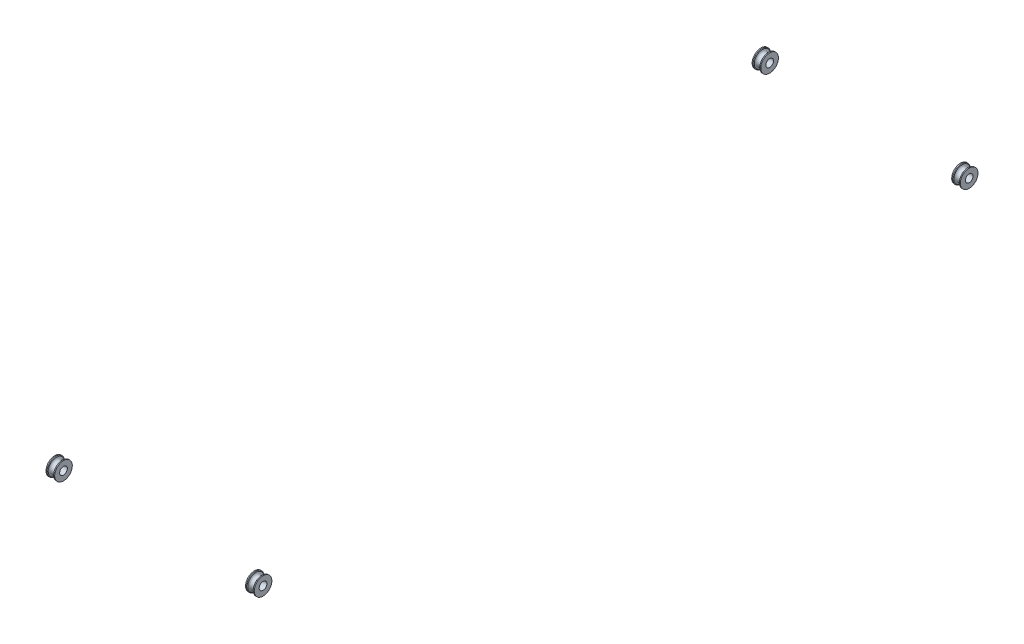
ISO-10303-21;
HEADER;
FILE_DESCRIPTION(('STEP AP214'),'2;1');
FILE_NAME('part.step','',(''),(''),'','','');
FILE_SCHEMA(('AUTOMOTIVE_DESIGN { 1 0 10303 214 1 1 1 1 }'));
ENDSEC;
DATA;
#1=APPLICATION_CONTEXT('core data for automotive mechanical design processes');
#2=APPLICATION_PROTOCOL_DEFINITION('international standard','automotive_design',2000,#1);
#3=PRODUCT_CONTEXT('',#1,'mechanical');
#4=PRODUCT('Part','Part','',(#3));
#5=PRODUCT_RELATED_PRODUCT_CATEGORY('part','',(#4));
#6=PRODUCT_DEFINITION_FORMATION('','',#4);
#7=PRODUCT_DEFINITION_CONTEXT('part definition',#1,'design');
#8=PRODUCT_DEFINITION('design','',#6,#7);
#9=PRODUCT_DEFINITION_SHAPE('','',#8);
#10=(LENGTH_UNIT() NAMED_UNIT(*) SI_UNIT(.MILLI.,.METRE.));
#11=(NAMED_UNIT(*) PLANE_ANGLE_UNIT() SI_UNIT($,.RADIAN.));
#12=(NAMED_UNIT(*) SI_UNIT($,.STERADIAN.) SOLID_ANGLE_UNIT());
#13=UNCERTAINTY_MEASURE_WITH_UNIT(LENGTH_MEASURE(1.E-05),#10,'distance_accuracy_value','');
#14=(GEOMETRIC_REPRESENTATION_CONTEXT(3) GLOBAL_UNCERTAINTY_ASSIGNED_CONTEXT((#13)) GLOBAL_UNIT_ASSIGNED_CONTEXT((#10,
#11,#12)) REPRESENTATION_CONTEXT('',''));
#15=CARTESIAN_POINT('',(0.,0.,0.));
#16=DIRECTION('',(0.,0.,1.));
#17=DIRECTION('',(1.,0.,0.));
#18=AXIS2_PLACEMENT_3D('',#15,#16,#17);
#19=CARTESIAN_POINT('',(102.4128,-70.8025,2.2225));
#20=DIRECTION('',(1.,0.,0.));
#21=DIRECTION('',(0.,0.,1.));
#22=AXIS2_PLACEMENT_3D('',#19,#20,#21);
#23=PLANE('',#22);
#24=CARTESIAN_POINT('',(102.4128,-70.8025,12.7000000000002));
#25=DIRECTION('',(1.,0.,0.));
#26=DIRECTION('',(0.,0.,-1.));
#27=AXIS2_PLACEMENT_3D('',#24,#25,#26);
#28=CIRCLE('',#27,6.35000000000008);
#29=CARTESIAN_POINT('',(102.4128,-70.8025,6.35000000000008));
#30=VERTEX_POINT('',#29);
#31=EDGE_CURVE('P0_E43',#30,#30,#28,.T.);
#32=ORIENTED_EDGE('',*,*,#31,.F.);
#33=EDGE_LOOP('',(#32));
#34=FACE_BOUND('',#33,.T.);
#35=CARTESIAN_POINT('',(102.4128,-70.8025,12.7000000000002));
#36=DIRECTION('',(1.,0.,0.));
#37=DIRECTION('',(0.,0.,-1.));
#38=AXIS2_PLACEMENT_3D('',#35,#36,#37);
#39=CIRCLE('',#38,14.605);
#40=CARTESIAN_POINT('',(102.4128,-70.8025,-1.90499999999984));
#41=VERTEX_POINT('',#40);
#42=EDGE_CURVE('P0_E10',#41,#41,#39,.T.);
#43=ORIENTED_EDGE('',*,*,#42,.T.);
#44=EDGE_LOOP('',(#43));
#45=FACE_BOUND('',#44,.T.);
#46=ADVANCED_FACE('P0_F15',(#34,#45),#23,.T.);
#47=CARTESIAN_POINT('',(95.25,-70.8025,12.7000000000002));
#48=DIRECTION('',(-1.,0.,0.));
#49=DIRECTION('',(0.,0.,-1.));
#50=AXIS2_PLACEMENT_3D('',#47,#48,#49);
#51=CYLINDRICAL_SURFACE('',#50,14.605);
#52=ORIENTED_EDGE('',*,*,#42,.F.);
#53=EDGE_LOOP('',(#52));
#54=FACE_BOUND('',#53,.T.);
#55=CARTESIAN_POINT('',(100.7364,-70.8025,12.7000000000002));
#56=DIRECTION('',(1.,0.,0.));
#57=DIRECTION('',(0.,0.,-1.));
#58=AXIS2_PLACEMENT_3D('',#55,#56,#57);
#59=CIRCLE('',#58,14.605);
#60=CARTESIAN_POINT('',(100.7364,-70.8025,-1.90499999999984));
#61=VERTEX_POINT('',#60);
#62=EDGE_CURVE('P0_E21',#61,#61,#59,.T.);
#63=ORIENTED_EDGE('',*,*,#62,.T.);
#64=EDGE_LOOP('',(#63));
#65=FACE_BOUND('',#64,.T.);
#66=ADVANCED_FACE('P0_F50',(#54,#65),#51,.T.);
#67=CARTESIAN_POINT('',(100.7364,-70.8025,12.7000000000002));
#68=DIRECTION('',(1.,0.,0.));
#69=DIRECTION('',(0.,0.,1.));
#70=AXIS2_PLACEMENT_3D('',#67,#68,#69);
#71=CONICAL_SURFACE('',#70,14.605,0.93804749179267);
#72=CARTESIAN_POINT('',(99.8982,-70.8025,12.7000000000002));
#73=DIRECTION('',(1.,0.,0.));
#74=DIRECTION('',(0.,0.,-1.));
#75=AXIS2_PLACEMENT_3D('',#72,#73,#74);
#76=CIRCLE('',#75,13.462);
#77=CARTESIAN_POINT('',(99.8982,-70.8025,-0.761999999999841));
#78=VERTEX_POINT('',#77);
#79=EDGE_CURVE('P0_E25',#78,#78,#76,.T.);
#80=ORIENTED_EDGE('',*,*,#79,.T.);
#81=EDGE_LOOP('',(#80));
#82=FACE_BOUND('',#81,.T.);
#83=ORIENTED_EDGE('',*,*,#62,.F.);
#84=EDGE_LOOP('',(#83));
#85=FACE_BOUND('',#84,.T.);
#86=ADVANCED_FACE('P0_F55',(#82,#85),#71,.T.);
#87=CARTESIAN_POINT('',(95.25,-70.8025,12.7000000000002));
#88=DIRECTION('',(-1.,0.,0.));
#89=DIRECTION('',(0.,0.,-1.));
#90=AXIS2_PLACEMENT_3D('',#87,#88,#89);
#91=TOROIDAL_SURFACE('',#90,14.605,4.78667026647959);
#92=ORIENTED_EDGE('',*,*,#79,.F.);
#93=EDGE_LOOP('',(#92));
#94=FACE_BOUND('',#93,.T.);
#95=CARTESIAN_POINT('',(90.6018,-70.8025,12.7000000000002));
#96=DIRECTION('',(1.,0.,0.));
#97=DIRECTION('',(0.,0.,-1.));
#98=AXIS2_PLACEMENT_3D('',#95,#96,#97);
#99=CIRCLE('',#98,13.462);
#100=CARTESIAN_POINT('',(90.6018,-70.8025,-0.761999999999841));
#101=VERTEX_POINT('',#100);
#102=EDGE_CURVE('P0_E29',#101,#101,#99,.T.);
#103=ORIENTED_EDGE('',*,*,#102,.T.);
#104=EDGE_LOOP('',(#103));
#105=FACE_BOUND('',#104,.T.);
#106=ADVANCED_FACE('P0_F60',(#94,#105),#91,.F.);
#107=CARTESIAN_POINT('',(89.7636,-70.8025,12.7000000000002));
#108=DIRECTION('',(-1.,0.,0.));
#109=DIRECTION('',(0.,0.,-1.));
#110=AXIS2_PLACEMENT_3D('',#107,#108,#109);
#111=CONICAL_SURFACE('',#110,14.605,0.938047491792655);
#112=ORIENTED_EDGE('',*,*,#102,.F.);
#113=EDGE_LOOP('',(#112));
#114=FACE_BOUND('',#113,.T.);
#115=CARTESIAN_POINT('',(89.7636,-70.8025,12.7000000000002));
#116=DIRECTION('',(1.,0.,0.));
#117=DIRECTION('',(0.,0.,-1.));
#118=AXIS2_PLACEMENT_3D('',#115,#116,#117);
#119=CIRCLE('',#118,14.605);
#120=CARTESIAN_POINT('',(89.7636,-70.8025,-1.90499999999984));
#121=VERTEX_POINT('',#120);
#122=EDGE_CURVE('P0_E34',#121,#121,#119,.T.);
#123=ORIENTED_EDGE('',*,*,#122,.T.);
#124=EDGE_LOOP('',(#123));
#125=FACE_BOUND('',#124,.T.);
#126=ADVANCED_FACE('P0_F66',(#114,#125),#111,.T.);
#127=CARTESIAN_POINT('',(95.25,-70.8025,12.7000000000002));
#128=DIRECTION('',(-1.,0.,0.));
#129=DIRECTION('',(0.,0.,-1.));
#130=AXIS2_PLACEMENT_3D('',#127,#128,#129);
#131=CYLINDRICAL_SURFACE('',#130,14.605);
#132=ORIENTED_EDGE('',*,*,#122,.F.);
#133=EDGE_LOOP('',(#132));
#134=FACE_BOUND('',#133,.T.);
#135=CARTESIAN_POINT('',(88.0872,-70.8025,12.7000000000002));
#136=DIRECTION('',(1.,0.,0.));
#137=DIRECTION('',(0.,0.,-1.));
#138=AXIS2_PLACEMENT_3D('',#135,#136,#137);
#139=CIRCLE('',#138,14.605);
#140=CARTESIAN_POINT('',(88.0872,-70.8025,-1.90499999999984));
#141=VERTEX_POINT('',#140);
#142=EDGE_CURVE('P0_E37',#141,#141,#139,.T.);
#143=ORIENTED_EDGE('',*,*,#142,.T.);
#144=EDGE_LOOP('',(#143));
#145=FACE_BOUND('',#144,.T.);
#146=ADVANCED_FACE('P0_F70',(#134,#145),#131,.T.);
#147=CARTESIAN_POINT('',(88.0872,-70.8025,2.2225));
#148=DIRECTION('',(-1.,0.,0.));
#149=DIRECTION('',(0.,0.,-1.));
#150=AXIS2_PLACEMENT_3D('',#147,#148,#149);
#151=PLANE('',#150);
#152=ORIENTED_EDGE('',*,*,#142,.F.);
#153=EDGE_LOOP('',(#152));
#154=FACE_BOUND('',#153,.T.);
#155=CARTESIAN_POINT('',(88.0872,-70.8025,12.7000000000002));
#156=DIRECTION('',(1.,0.,0.));
#157=DIRECTION('',(0.,0.,-1.));
#158=AXIS2_PLACEMENT_3D('',#155,#156,#157);
#159=CIRCLE('',#158,6.35000000000008);
#160=CARTESIAN_POINT('',(88.0872,-70.8025,6.35000000000008));
#161=VERTEX_POINT('',#160);
#162=EDGE_CURVE('P0_E40',#161,#161,#159,.T.);
#163=ORIENTED_EDGE('',*,*,#162,.T.);
#164=EDGE_LOOP('',(#163));
#165=FACE_BOUND('',#164,.T.);
#166=ADVANCED_FACE('P0_F74',(#154,#165),#151,.T.);
#167=CARTESIAN_POINT('',(95.25,-70.8025,12.7000000000002));
#168=DIRECTION('',(-1.,0.,0.));
#169=DIRECTION('',(0.,0.,-1.));
#170=AXIS2_PLACEMENT_3D('',#167,#168,#169);
#171=CYLINDRICAL_SURFACE('',#170,6.35000000000008);
#172=ORIENTED_EDGE('',*,*,#162,.F.);
#173=EDGE_LOOP('',(#172));
#174=FACE_BOUND('',#173,.T.);
#175=ORIENTED_EDGE('',*,*,#31,.T.);
#176=EDGE_LOOP('',(#175));
#177=FACE_BOUND('',#176,.T.);
#178=ADVANCED_FACE('P0_F47',(#174,#177),#171,.F.);
#179=CLOSED_SHELL('',(#46,#66,#86,#106,#126,#146,#166,#178));
#180=MANIFOLD_SOLID_BREP('P0_B1',#179);
#181=CARTESIAN_POINT('',(102.4128,-70.8025,1191.5775));
#182=DIRECTION('',(1.,0.,0.));
#183=DIRECTION('',(0.,0.,-1.));
#184=AXIS2_PLACEMENT_3D('',#181,#182,#183);
#185=PLANE('',#184);
#186=CARTESIAN_POINT('',(102.4128,-70.8025,1181.1));
#187=DIRECTION('',(-1.,0.,0.));
#188=DIRECTION('',(0.,0.,1.));
#189=AXIS2_PLACEMENT_3D('',#186,#187,#188);
#190=CIRCLE('',#189,6.35000000000008);
#191=CARTESIAN_POINT('',(102.4128,-70.8025,1187.45));
#192=VERTEX_POINT('',#191);
#193=EDGE_CURVE('P1_E43',#192,#192,#190,.T.);
#194=ORIENTED_EDGE('',*,*,#193,.T.);
#195=EDGE_LOOP('',(#194));
#196=FACE_BOUND('',#195,.T.);
#197=CARTESIAN_POINT('',(102.4128,-70.8025,1181.1));
#198=DIRECTION('',(-1.,0.,0.));
#199=DIRECTION('',(0.,0.,1.));
#200=AXIS2_PLACEMENT_3D('',#197,#198,#199);
#201=CIRCLE('',#200,14.605);
#202=CARTESIAN_POINT('',(102.4128,-70.8025,1195.705));
#203=VERTEX_POINT('',#202);
#204=EDGE_CURVE('P1_E10',#203,#203,#201,.T.);
#205=ORIENTED_EDGE('',*,*,#204,.F.);
#206=EDGE_LOOP('',(#205));
#207=FACE_BOUND('',#206,.T.);
#208=ADVANCED_FACE('P1_F15',(#196,#207),#185,.T.);
#209=CARTESIAN_POINT('',(95.25,-70.8025,1181.1));
#210=DIRECTION('',(-1.,0.,0.));
#211=DIRECTION('',(0.,0.,1.));
#212=AXIS2_PLACEMENT_3D('',#209,#210,#211);
#213=CYLINDRICAL_SURFACE('',#212,14.605);
#214=ORIENTED_EDGE('',*,*,#204,.T.);
#215=EDGE_LOOP('',(#214));
#216=FACE_BOUND('',#215,.T.);
#217=CARTESIAN_POINT('',(100.7364,-70.8025,1181.1));
#218=DIRECTION('',(-1.,0.,0.));
#219=DIRECTION('',(0.,0.,1.));
#220=AXIS2_PLACEMENT_3D('',#217,#218,#219);
#221=CIRCLE('',#220,14.605);
#222=CARTESIAN_POINT('',(100.7364,-70.8025,1195.705));
#223=VERTEX_POINT('',#222);
#224=EDGE_CURVE('P1_E21',#223,#223,#221,.T.);
#225=ORIENTED_EDGE('',*,*,#224,.F.);
#226=EDGE_LOOP('',(#225));
#227=FACE_BOUND('',#226,.T.);
#228=ADVANCED_FACE('P1_F62',(#216,#227),#213,.T.);
#229=CARTESIAN_POINT('',(100.7364,-70.8025,1181.1));
#230=DIRECTION('',(1.,0.,0.));
#231=DIRECTION('',(0.,0.,-1.));
#232=AXIS2_PLACEMENT_3D('',#229,#230,#231);
#233=CONICAL_SURFACE('',#232,14.605,0.93804749179267);
#234=CARTESIAN_POINT('',(99.8982,-70.8025,1181.1));
#235=DIRECTION('',(-1.,0.,0.));
#236=DIRECTION('',(0.,0.,1.));
#237=AXIS2_PLACEMENT_3D('',#234,#235,#236);
#238=CIRCLE('',#237,13.462);
#239=CARTESIAN_POINT('',(99.8982,-70.8025,1194.562));
#240=VERTEX_POINT('',#239);
#241=EDGE_CURVE('P1_E25',#240,#240,#238,.T.);
#242=ORIENTED_EDGE('',*,*,#241,.F.);
#243=EDGE_LOOP('',(#242));
#244=FACE_BOUND('',#243,.T.);
#245=ORIENTED_EDGE('',*,*,#224,.T.);
#246=EDGE_LOOP('',(#245));
#247=FACE_BOUND('',#246,.T.);
#248=ADVANCED_FACE('P1_F66',(#244,#247),#233,.T.);
#249=CARTESIAN_POINT('',(95.25,-70.8025,1181.1));
#250=DIRECTION('',(-1.,0.,0.));
#251=DIRECTION('',(0.,0.,1.));
#252=AXIS2_PLACEMENT_3D('',#249,#250,#251);
#253=TOROIDAL_SURFACE('',#252,14.605,4.78667026647959);
#254=ORIENTED_EDGE('',*,*,#241,.T.);
#255=EDGE_LOOP('',(#254));
#256=FACE_BOUND('',#255,.T.);
#257=CARTESIAN_POINT('',(90.6018,-70.8025,1181.1));
#258=DIRECTION('',(-1.,0.,0.));
#259=DIRECTION('',(0.,0.,1.));
#260=AXIS2_PLACEMENT_3D('',#257,#258,#259);
#261=CIRCLE('',#260,13.462);
#262=CARTESIAN_POINT('',(90.6018,-70.8025,1194.562));
#263=VERTEX_POINT('',#262);
#264=EDGE_CURVE('P1_E29',#263,#263,#261,.T.);
#265=ORIENTED_EDGE('',*,*,#264,.F.);
#266=EDGE_LOOP('',(#265));
#267=FACE_BOUND('',#266,.T.);
#268=ADVANCED_FACE('P1_F70',(#256,#267),#253,.F.);
#269=CARTESIAN_POINT('',(89.7636,-70.8025,1181.1));
#270=DIRECTION('',(-1.,0.,0.));
#271=DIRECTION('',(0.,0.,1.));
#272=AXIS2_PLACEMENT_3D('',#269,#270,#271);
#273=CONICAL_SURFACE('',#272,14.605,0.938047491792655);
#274=ORIENTED_EDGE('',*,*,#264,.T.);
#275=EDGE_LOOP('',(#274));
#276=FACE_BOUND('',#275,.T.);
#277=CARTESIAN_POINT('',(89.7636,-70.8025,1181.1));
#278=DIRECTION('',(-1.,0.,0.));
#279=DIRECTION('',(0.,0.,1.));
#280=AXIS2_PLACEMENT_3D('',#277,#278,#279);
#281=CIRCLE('',#280,14.605);
#282=CARTESIAN_POINT('',(89.7636,-70.8025,1195.705));
#283=VERTEX_POINT('',#282);
#284=EDGE_CURVE('P1_E34',#283,#283,#281,.T.);
#285=ORIENTED_EDGE('',*,*,#284,.F.);
#286=EDGE_LOOP('',(#285));
#287=FACE_BOUND('',#286,.T.);
#288=ADVANCED_FACE('P1_F77',(#276,#287),#273,.T.);
#289=CARTESIAN_POINT('',(95.25,-70.8025,1181.1));
#290=DIRECTION('',(-1.,0.,0.));
#291=DIRECTION('',(0.,0.,1.));
#292=AXIS2_PLACEMENT_3D('',#289,#290,#291);
#293=CYLINDRICAL_SURFACE('',#292,14.605);
#294=ORIENTED_EDGE('',*,*,#284,.T.);
#295=EDGE_LOOP('',(#294));
#296=FACE_BOUND('',#295,.T.);
#297=CARTESIAN_POINT('',(88.0872,-70.8025,1181.1));
#298=DIRECTION('',(-1.,0.,0.));
#299=DIRECTION('',(0.,0.,1.));
#300=AXIS2_PLACEMENT_3D('',#297,#298,#299);
#301=CIRCLE('',#300,14.605);
#302=CARTESIAN_POINT('',(88.0872,-70.8025,1195.705));
#303=VERTEX_POINT('',#302);
#304=EDGE_CURVE('P1_E37',#303,#303,#301,.T.);
#305=ORIENTED_EDGE('',*,*,#304,.F.);
#306=EDGE_LOOP('',(#305));
#307=FACE_BOUND('',#306,.T.);
#308=ADVANCED_FACE('P1_F58',(#296,#307),#293,.T.);
#309=CARTESIAN_POINT('',(88.0872,-70.8025,1191.5775));
#310=DIRECTION('',(-1.,0.,0.));
#311=DIRECTION('',(0.,0.,1.));
#312=AXIS2_PLACEMENT_3D('',#309,#310,#311);
#313=PLANE('',#312);
#314=ORIENTED_EDGE('',*,*,#304,.T.);
#315=EDGE_LOOP('',(#314));
#316=FACE_BOUND('',#315,.T.);
#317=CARTESIAN_POINT('',(88.0872,-70.8025,1181.1));
#318=DIRECTION('',(-1.,0.,0.));
#319=DIRECTION('',(0.,0.,1.));
#320=AXIS2_PLACEMENT_3D('',#317,#318,#319);
#321=CIRCLE('',#320,6.35000000000008);
#322=CARTESIAN_POINT('',(88.0872,-70.8025,1187.45));
#323=VERTEX_POINT('',#322);
#324=EDGE_CURVE('P1_E40',#323,#323,#321,.T.);
#325=ORIENTED_EDGE('',*,*,#324,.F.);
#326=EDGE_LOOP('',(#325));
#327=FACE_BOUND('',#326,.T.);
#328=ADVANCED_FACE('P1_F51',(#316,#327),#313,.T.);
#329=CARTESIAN_POINT('',(95.25,-70.8025,1181.1));
#330=DIRECTION('',(-1.,0.,0.));
#331=DIRECTION('',(0.,0.,1.));
#332=AXIS2_PLACEMENT_3D('',#329,#330,#331);
#333=CYLINDRICAL_SURFACE('',#332,6.35000000000008);
#334=ORIENTED_EDGE('',*,*,#324,.T.);
#335=EDGE_LOOP('',(#334));
#336=FACE_BOUND('',#335,.T.);
#337=ORIENTED_EDGE('',*,*,#193,.F.);
#338=EDGE_LOOP('',(#337));
#339=FACE_BOUND('',#338,.T.);
#340=ADVANCED_FACE('P1_F49',(#336,#339),#333,.F.);
#341=CLOSED_SHELL('',(#208,#228,#248,#268,#288,#308,#328,#340));
#342=MANIFOLD_SOLID_BREP('P1_B1',#341);
#343=CARTESIAN_POINT('',(418.2872,-70.8025,1191.5775));
#344=DIRECTION('',(-1.,0.,0.));
#345=DIRECTION('',(0.,0.,-1.));
#346=AXIS2_PLACEMENT_3D('',#343,#344,#345);
#347=PLANE('',#346);
#348=CARTESIAN_POINT('',(418.2872,-70.8025,1181.1));
#349=DIRECTION('',(-1.,0.,0.));
#350=DIRECTION('',(0.,0.,1.));
#351=AXIS2_PLACEMENT_3D('',#348,#349,#350);
#352=CIRCLE('',#351,6.35000000000008);
#353=CARTESIAN_POINT('',(418.2872,-70.8025,1187.45));
#354=VERTEX_POINT('',#353);
#355=EDGE_CURVE('P2_E43',#354,#354,#352,.T.);
#356=ORIENTED_EDGE('',*,*,#355,.F.);
#357=EDGE_LOOP('',(#356));
#358=FACE_BOUND('',#357,.T.);
#359=CARTESIAN_POINT('',(418.2872,-70.8025,1181.1));
#360=DIRECTION('',(-1.,0.,0.));
#361=DIRECTION('',(0.,0.,1.));
#362=AXIS2_PLACEMENT_3D('',#359,#360,#361);
#363=CIRCLE('',#362,14.605);
#364=CARTESIAN_POINT('',(418.2872,-70.8025,1195.705));
#365=VERTEX_POINT('',#364);
#366=EDGE_CURVE('P2_E10',#365,#365,#363,.T.);
#367=ORIENTED_EDGE('',*,*,#366,.T.);
#368=EDGE_LOOP('',(#367));
#369=FACE_BOUND('',#368,.T.);
#370=ADVANCED_FACE('P2_F15',(#358,#369),#347,.T.);
#371=CARTESIAN_POINT('',(425.45,-70.8025,1181.1));
#372=DIRECTION('',(1.,0.,0.));
#373=DIRECTION('',(0.,0.,1.));
#374=AXIS2_PLACEMENT_3D('',#371,#372,#373);
#375=CYLINDRICAL_SURFACE('',#374,14.605);
#376=ORIENTED_EDGE('',*,*,#366,.F.);
#377=EDGE_LOOP('',(#376));
#378=FACE_BOUND('',#377,.T.);
#379=CARTESIAN_POINT('',(419.9636,-70.8025,1181.1));
#380=DIRECTION('',(-1.,0.,0.));
#381=DIRECTION('',(0.,0.,1.));
#382=AXIS2_PLACEMENT_3D('',#379,#380,#381);
#383=CIRCLE('',#382,14.605);
#384=CARTESIAN_POINT('',(419.9636,-70.8025,1195.705));
#385=VERTEX_POINT('',#384);
#386=EDGE_CURVE('P2_E21',#385,#385,#383,.T.);
#387=ORIENTED_EDGE('',*,*,#386,.T.);
#388=EDGE_LOOP('',(#387));
#389=FACE_BOUND('',#388,.T.);
#390=ADVANCED_FACE('P2_F50',(#378,#389),#375,.T.);
#391=CARTESIAN_POINT('',(419.9636,-70.8025,1181.1));
#392=DIRECTION('',(-1.,0.,0.));
#393=DIRECTION('',(0.,0.,-1.));
#394=AXIS2_PLACEMENT_3D('',#391,#392,#393);
#395=CONICAL_SURFACE('',#394,14.605,0.93804749179267);
#396=CARTESIAN_POINT('',(420.8018,-70.8025,1181.1));
#397=DIRECTION('',(-1.,0.,0.));
#398=DIRECTION('',(0.,0.,1.));
#399=AXIS2_PLACEMENT_3D('',#396,#397,#398);
#400=CIRCLE('',#399,13.462);
#401=CARTESIAN_POINT('',(420.8018,-70.8025,1194.562));
#402=VERTEX_POINT('',#401);
#403=EDGE_CURVE('P2_E25',#402,#402,#400,.T.);
#404=ORIENTED_EDGE('',*,*,#403,.T.);
#405=EDGE_LOOP('',(#404));
#406=FACE_BOUND('',#405,.T.);
#407=ORIENTED_EDGE('',*,*,#386,.F.);
#408=EDGE_LOOP('',(#407));
#409=FACE_BOUND('',#408,.T.);
#410=ADVANCED_FACE('P2_F55',(#406,#409),#395,.T.);
#411=CARTESIAN_POINT('',(425.45,-70.8025,1181.1));
#412=DIRECTION('',(1.,0.,0.));
#413=DIRECTION('',(0.,0.,1.));
#414=AXIS2_PLACEMENT_3D('',#411,#412,#413);
#415=TOROIDAL_SURFACE('',#414,14.605,4.78667026647959);
#416=ORIENTED_EDGE('',*,*,#403,.F.);
#417=EDGE_LOOP('',(#416));
#418=FACE_BOUND('',#417,.T.);
#419=CARTESIAN_POINT('',(430.0982,-70.8025,1181.1));
#420=DIRECTION('',(-1.,0.,0.));
#421=DIRECTION('',(0.,0.,1.));
#422=AXIS2_PLACEMENT_3D('',#419,#420,#421);
#423=CIRCLE('',#422,13.462);
#424=CARTESIAN_POINT('',(430.0982,-70.8025,1194.562));
#425=VERTEX_POINT('',#424);
#426=EDGE_CURVE('P2_E29',#425,#425,#423,.T.);
#427=ORIENTED_EDGE('',*,*,#426,.T.);
#428=EDGE_LOOP('',(#427));
#429=FACE_BOUND('',#428,.T.);
#430=ADVANCED_FACE('P2_F60',(#418,#429),#415,.F.);
#431=CARTESIAN_POINT('',(430.9364,-70.8025,1181.1));
#432=DIRECTION('',(1.,0.,0.));
#433=DIRECTION('',(0.,0.,1.));
#434=AXIS2_PLACEMENT_3D('',#431,#432,#433);
#435=CONICAL_SURFACE('',#434,14.605,0.938047491792655);
#436=ORIENTED_EDGE('',*,*,#426,.F.);
#437=EDGE_LOOP('',(#436));
#438=FACE_BOUND('',#437,.T.);
#439=CARTESIAN_POINT('',(430.9364,-70.8025,1181.1));
#440=DIRECTION('',(-1.,0.,0.));
#441=DIRECTION('',(0.,0.,1.));
#442=AXIS2_PLACEMENT_3D('',#439,#440,#441);
#443=CIRCLE('',#442,14.605);
#444=CARTESIAN_POINT('',(430.9364,-70.8025,1195.705));
#445=VERTEX_POINT('',#444);
#446=EDGE_CURVE('P2_E34',#445,#445,#443,.T.);
#447=ORIENTED_EDGE('',*,*,#446,.T.);
#448=EDGE_LOOP('',(#447));
#449=FACE_BOUND('',#448,.T.);
#450=ADVANCED_FACE('P2_F66',(#438,#449),#435,.T.);
#451=CARTESIAN_POINT('',(425.45,-70.8025,1181.1));
#452=DIRECTION('',(1.,0.,0.));
#453=DIRECTION('',(0.,0.,1.));
#454=AXIS2_PLACEMENT_3D('',#451,#452,#453);
#455=CYLINDRICAL_SURFACE('',#454,14.605);
#456=ORIENTED_EDGE('',*,*,#446,.F.);
#457=EDGE_LOOP('',(#456));
#458=FACE_BOUND('',#457,.T.);
#459=CARTESIAN_POINT('',(432.6128,-70.8025,1181.1));
#460=DIRECTION('',(-1.,0.,0.));
#461=DIRECTION('',(0.,0.,1.));
#462=AXIS2_PLACEMENT_3D('',#459,#460,#461);
#463=CIRCLE('',#462,14.605);
#464=CARTESIAN_POINT('',(432.6128,-70.8025,1195.705));
#465=VERTEX_POINT('',#464);
#466=EDGE_CURVE('P2_E37',#465,#465,#463,.T.);
#467=ORIENTED_EDGE('',*,*,#466,.T.);
#468=EDGE_LOOP('',(#467));
#469=FACE_BOUND('',#468,.T.);
#470=ADVANCED_FACE('P2_F70',(#458,#469),#455,.T.);
#471=CARTESIAN_POINT('',(432.6128,-70.8025,1191.5775));
#472=DIRECTION('',(1.,0.,0.));
#473=DIRECTION('',(0.,0.,1.));
#474=AXIS2_PLACEMENT_3D('',#471,#472,#473);
#475=PLANE('',#474);
#476=ORIENTED_EDGE('',*,*,#466,.F.);
#477=EDGE_LOOP('',(#476));
#478=FACE_BOUND('',#477,.T.);
#479=CARTESIAN_POINT('',(432.6128,-70.8025,1181.1));
#480=DIRECTION('',(-1.,0.,0.));
#481=DIRECTION('',(0.,0.,1.));
#482=AXIS2_PLACEMENT_3D('',#479,#480,#481);
#483=CIRCLE('',#482,6.35000000000008);
#484=CARTESIAN_POINT('',(432.6128,-70.8025,1187.45));
#485=VERTEX_POINT('',#484);
#486=EDGE_CURVE('P2_E40',#485,#485,#483,.T.);
#487=ORIENTED_EDGE('',*,*,#486,.T.);
#488=EDGE_LOOP('',(#487));
#489=FACE_BOUND('',#488,.T.);
#490=ADVANCED_FACE('P2_F74',(#478,#489),#475,.T.);
#491=CARTESIAN_POINT('',(425.45,-70.8025,1181.1));
#492=DIRECTION('',(1.,0.,0.));
#493=DIRECTION('',(0.,0.,1.));
#494=AXIS2_PLACEMENT_3D('',#491,#492,#493);
#495=CYLINDRICAL_SURFACE('',#494,6.35000000000008);
#496=ORIENTED_EDGE('',*,*,#486,.F.);
#497=EDGE_LOOP('',(#496));
#498=FACE_BOUND('',#497,.T.);
#499=ORIENTED_EDGE('',*,*,#355,.T.);
#500=EDGE_LOOP('',(#499));
#501=FACE_BOUND('',#500,.T.);
#502=ADVANCED_FACE('P2_F47',(#498,#501),#495,.F.);
#503=CLOSED_SHELL('',(#370,#390,#410,#430,#450,#470,#490,#502));
#504=MANIFOLD_SOLID_BREP('P2_B1',#503);
#505=CARTESIAN_POINT('',(418.2872,-70.8025,2.2225));
#506=DIRECTION('',(-1.,0.,0.));
#507=DIRECTION('',(0.,0.,1.));
#508=AXIS2_PLACEMENT_3D('',#505,#506,#507);
#509=PLANE('',#508);
#510=CARTESIAN_POINT('',(418.2872,-70.8025,12.7));
#511=DIRECTION('',(1.,0.,0.));
#512=DIRECTION('',(0.,0.,-1.));
#513=AXIS2_PLACEMENT_3D('',#510,#511,#512);
#514=CIRCLE('',#513,6.35000000000008);
#515=CARTESIAN_POINT('',(418.2872,-70.8025,6.34999999999992));
#516=VERTEX_POINT('',#515);
#517=EDGE_CURVE('P3_E43',#516,#516,#514,.T.);
#518=ORIENTED_EDGE('',*,*,#517,.T.);
#519=EDGE_LOOP('',(#518));
#520=FACE_BOUND('',#519,.T.);
#521=CARTESIAN_POINT('',(418.2872,-70.8025,12.7));
#522=DIRECTION('',(1.,0.,0.));
#523=DIRECTION('',(0.,0.,-1.));
#524=AXIS2_PLACEMENT_3D('',#521,#522,#523);
#525=CIRCLE('',#524,14.605);
#526=CARTESIAN_POINT('',(418.2872,-70.8025,-1.905));
#527=VERTEX_POINT('',#526);
#528=EDGE_CURVE('P3_E10',#527,#527,#525,.T.);
#529=ORIENTED_EDGE('',*,*,#528,.F.);
#530=EDGE_LOOP('',(#529));
#531=FACE_BOUND('',#530,.T.);
#532=ADVANCED_FACE('P3_F15',(#520,#531),#509,.T.);
#533=CARTESIAN_POINT('',(425.45,-70.8025,12.7));
#534=DIRECTION('',(1.,0.,0.));
#535=DIRECTION('',(0.,0.,-1.));
#536=AXIS2_PLACEMENT_3D('',#533,#534,#535);
#537=CYLINDRICAL_SURFACE('',#536,14.605);
#538=ORIENTED_EDGE('',*,*,#528,.T.);
#539=EDGE_LOOP('',(#538));
#540=FACE_BOUND('',#539,.T.);
#541=CARTESIAN_POINT('',(419.9636,-70.8025,12.7));
#542=DIRECTION('',(1.,0.,0.));
#543=DIRECTION('',(0.,0.,-1.));
#544=AXIS2_PLACEMENT_3D('',#541,#542,#543);
#545=CIRCLE('',#544,14.605);
#546=CARTESIAN_POINT('',(419.9636,-70.8025,-1.905));
#547=VERTEX_POINT('',#546);
#548=EDGE_CURVE('P3_E21',#547,#547,#545,.T.);
#549=ORIENTED_EDGE('',*,*,#548,.F.);
#550=EDGE_LOOP('',(#549));
#551=FACE_BOUND('',#550,.T.);
#552=ADVANCED_FACE('P3_F62',(#540,#551),#537,.T.);
#553=CARTESIAN_POINT('',(419.9636,-70.8025,12.7));
#554=DIRECTION('',(-1.,0.,0.));
#555=DIRECTION('',(0.,0.,1.));
#556=AXIS2_PLACEMENT_3D('',#553,#554,#555);
#557=CONICAL_SURFACE('',#556,14.605,0.93804749179267);
#558=CARTESIAN_POINT('',(420.8018,-70.8025,12.7));
#559=DIRECTION('',(1.,0.,0.));
#560=DIRECTION('',(0.,0.,-1.));
#561=AXIS2_PLACEMENT_3D('',#558,#559,#560);
#562=CIRCLE('',#561,13.462);
#563=CARTESIAN_POINT('',(420.8018,-70.8025,-0.762000000000001));
#564=VERTEX_POINT('',#563);
#565=EDGE_CURVE('P3_E25',#564,#564,#562,.T.);
#566=ORIENTED_EDGE('',*,*,#565,.F.);
#567=EDGE_LOOP('',(#566));
#568=FACE_BOUND('',#567,.T.);
#569=ORIENTED_EDGE('',*,*,#548,.T.);
#570=EDGE_LOOP('',(#569));
#571=FACE_BOUND('',#570,.T.);
#572=ADVANCED_FACE('P3_F66',(#568,#571),#557,.T.);
#573=CARTESIAN_POINT('',(425.45,-70.8025,12.7));
#574=DIRECTION('',(1.,0.,0.));
#575=DIRECTION('',(0.,0.,-1.));
#576=AXIS2_PLACEMENT_3D('',#573,#574,#575);
#577=TOROIDAL_SURFACE('',#576,14.605,4.78667026647959);
#578=ORIENTED_EDGE('',*,*,#565,.T.);
#579=EDGE_LOOP('',(#578));
#580=FACE_BOUND('',#579,.T.);
#581=CARTESIAN_POINT('',(430.0982,-70.8025,12.7));
#582=DIRECTION('',(1.,0.,0.));
#583=DIRECTION('',(0.,0.,-1.));
#584=AXIS2_PLACEMENT_3D('',#581,#582,#583);
#585=CIRCLE('',#584,13.462);
#586=CARTESIAN_POINT('',(430.0982,-70.8025,-0.762000000000001));
#587=VERTEX_POINT('',#586);
#588=EDGE_CURVE('P3_E29',#587,#587,#585,.T.);
#589=ORIENTED_EDGE('',*,*,#588,.F.);
#590=EDGE_LOOP('',(#589));
#591=FACE_BOUND('',#590,.T.);
#592=ADVANCED_FACE('P3_F70',(#580,#591),#577,.F.);
#593=CARTESIAN_POINT('',(430.9364,-70.8025,12.7));
#594=DIRECTION('',(1.,0.,0.));
#595=DIRECTION('',(0.,0.,-1.));
#596=AXIS2_PLACEMENT_3D('',#593,#594,#595);
#597=CONICAL_SURFACE('',#596,14.605,0.938047491792655);
#598=ORIENTED_EDGE('',*,*,#588,.T.);
#599=EDGE_LOOP('',(#598));
#600=FACE_BOUND('',#599,.T.);
#601=CARTESIAN_POINT('',(430.9364,-70.8025,12.7));
#602=DIRECTION('',(1.,0.,0.));
#603=DIRECTION('',(0.,0.,-1.));
#604=AXIS2_PLACEMENT_3D('',#601,#602,#603);
#605=CIRCLE('',#604,14.605);
#606=CARTESIAN_POINT('',(430.9364,-70.8025,-1.905));
#607=VERTEX_POINT('',#606);
#608=EDGE_CURVE('P3_E34',#607,#607,#605,.T.);
#609=ORIENTED_EDGE('',*,*,#608,.F.);
#610=EDGE_LOOP('',(#609));
#611=FACE_BOUND('',#610,.T.);
#612=ADVANCED_FACE('P3_F77',(#600,#611),#597,.T.);
#613=CARTESIAN_POINT('',(425.45,-70.8025,12.7));
#614=DIRECTION('',(1.,0.,0.));
#615=DIRECTION('',(0.,0.,-1.));
#616=AXIS2_PLACEMENT_3D('',#613,#614,#615);
#617=CYLINDRICAL_SURFACE('',#616,14.605);
#618=ORIENTED_EDGE('',*,*,#608,.T.);
#619=EDGE_LOOP('',(#618));
#620=FACE_BOUND('',#619,.T.);
#621=CARTESIAN_POINT('',(432.6128,-70.8025,12.7));
#622=DIRECTION('',(1.,0.,0.));
#623=DIRECTION('',(0.,0.,-1.));
#624=AXIS2_PLACEMENT_3D('',#621,#622,#623);
#625=CIRCLE('',#624,14.605);
#626=CARTESIAN_POINT('',(432.6128,-70.8025,-1.905));
#627=VERTEX_POINT('',#626);
#628=EDGE_CURVE('P3_E37',#627,#627,#625,.T.);
#629=ORIENTED_EDGE('',*,*,#628,.F.);
#630=EDGE_LOOP('',(#629));
#631=FACE_BOUND('',#630,.T.);
#632=ADVANCED_FACE('P3_F58',(#620,#631),#617,.T.);
#633=CARTESIAN_POINT('',(432.6128,-70.8025,2.2225));
#634=DIRECTION('',(1.,0.,0.));
#635=DIRECTION('',(0.,0.,-1.));
#636=AXIS2_PLACEMENT_3D('',#633,#634,#635);
#637=PLANE('',#636);
#638=ORIENTED_EDGE('',*,*,#628,.T.);
#639=EDGE_LOOP('',(#638));
#640=FACE_BOUND('',#639,.T.);
#641=CARTESIAN_POINT('',(432.6128,-70.8025,12.7));
#642=DIRECTION('',(1.,0.,0.));
#643=DIRECTION('',(0.,0.,-1.));
#644=AXIS2_PLACEMENT_3D('',#641,#642,#643);
#645=CIRCLE('',#644,6.35000000000008);
#646=CARTESIAN_POINT('',(432.6128,-70.8025,6.34999999999992));
#647=VERTEX_POINT('',#646);
#648=EDGE_CURVE('P3_E40',#647,#647,#645,.T.);
#649=ORIENTED_EDGE('',*,*,#648,.F.);
#650=EDGE_LOOP('',(#649));
#651=FACE_BOUND('',#650,.T.);
#652=ADVANCED_FACE('P3_F51',(#640,#651),#637,.T.);
#653=CARTESIAN_POINT('',(425.45,-70.8025,12.7));
#654=DIRECTION('',(1.,0.,0.));
#655=DIRECTION('',(0.,0.,-1.));
#656=AXIS2_PLACEMENT_3D('',#653,#654,#655);
#657=CYLINDRICAL_SURFACE('',#656,6.35000000000008);
#658=ORIENTED_EDGE('',*,*,#648,.T.);
#659=EDGE_LOOP('',(#658));
#660=FACE_BOUND('',#659,.T.);
#661=ORIENTED_EDGE('',*,*,#517,.F.);
#662=EDGE_LOOP('',(#661));
#663=FACE_BOUND('',#662,.T.);
#664=ADVANCED_FACE('P3_F49',(#660,#663),#657,.F.);
#665=CLOSED_SHELL('',(#532,#552,#572,#592,#612,#632,#652,#664));
#666=MANIFOLD_SOLID_BREP('P3_B1',#665);
#667=ADVANCED_BREP_SHAPE_REPRESENTATION('',(#18,#180,#342,#504,#666),#14);
#668=SHAPE_DEFINITION_REPRESENTATION(#9,#667);
ENDSEC;
END-ISO-10303-21;
